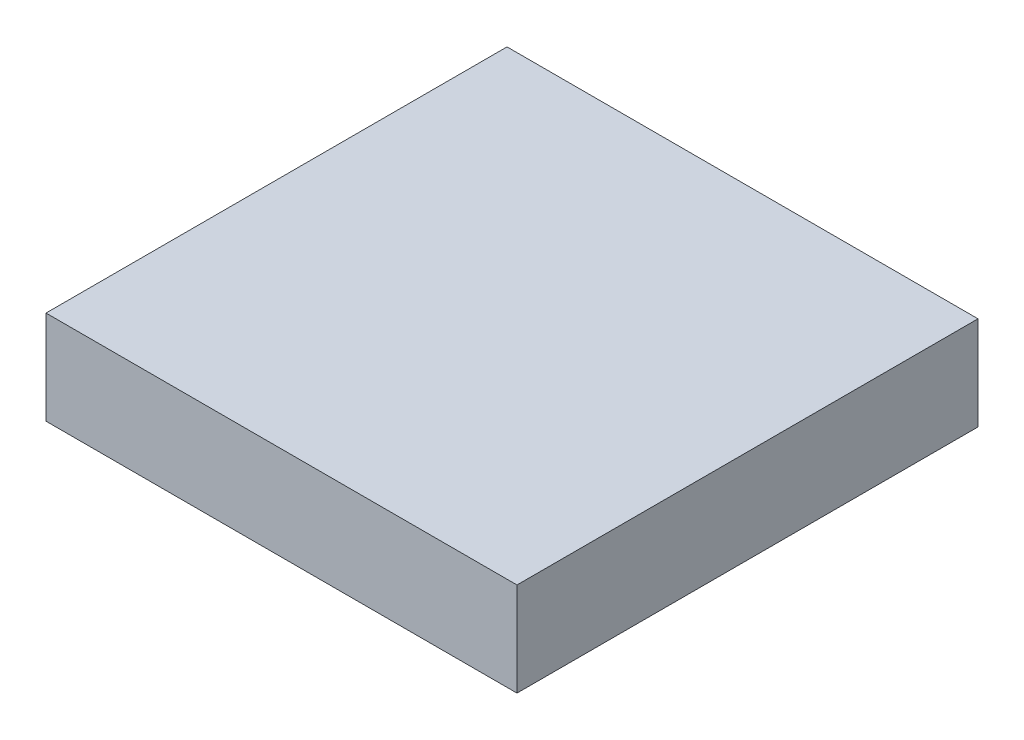
ISO-10303-21;
HEADER;
FILE_DESCRIPTION(('STEP AP214'),'2;1');
FILE_NAME('part.step','',(''),(''),'','','');
FILE_SCHEMA(('AUTOMOTIVE_DESIGN { 1 0 10303 214 1 1 1 1 }'));
ENDSEC;
DATA;
#1=APPLICATION_CONTEXT('core data for automotive mechanical design processes');
#2=APPLICATION_PROTOCOL_DEFINITION('international standard','automotive_design',2000,#1);
#3=PRODUCT_CONTEXT('',#1,'mechanical');
#4=PRODUCT('Part','Part','',(#3));
#5=PRODUCT_RELATED_PRODUCT_CATEGORY('part','',(#4));
#6=PRODUCT_DEFINITION_FORMATION('','',#4);
#7=PRODUCT_DEFINITION_CONTEXT('part definition',#1,'design');
#8=PRODUCT_DEFINITION('design','',#6,#7);
#9=PRODUCT_DEFINITION_SHAPE('','',#8);
#10=(LENGTH_UNIT() NAMED_UNIT(*) SI_UNIT(.MILLI.,.METRE.));
#11=(NAMED_UNIT(*) PLANE_ANGLE_UNIT() SI_UNIT($,.RADIAN.));
#12=(NAMED_UNIT(*) SI_UNIT($,.STERADIAN.) SOLID_ANGLE_UNIT());
#13=UNCERTAINTY_MEASURE_WITH_UNIT(LENGTH_MEASURE(1.E-05),#10,'distance_accuracy_value','');
#14=(GEOMETRIC_REPRESENTATION_CONTEXT(3) GLOBAL_UNCERTAINTY_ASSIGNED_CONTEXT((#13)) GLOBAL_UNIT_ASSIGNED_CONTEXT((#10,
#11,#12)) REPRESENTATION_CONTEXT('',''));
#15=CARTESIAN_POINT('',(0.,0.,0.));
#16=DIRECTION('',(0.,0.,1.));
#17=DIRECTION('',(1.,0.,0.));
#18=AXIS2_PLACEMENT_3D('',#15,#16,#17);
#19=CARTESIAN_POINT('',(-0.46,0.0684,1.));
#20=DIRECTION('',(1.,0.,0.));
#21=DIRECTION('',(0.,0.,-1.));
#22=AXIS2_PLACEMENT_3D('',#19,#20,#21);
#23=PLANE('',#22);
#24=DIRECTION('',(0.,-1.,0.));
#25=VECTOR('',#24,1.);
#26=CARTESIAN_POINT('',(-0.46,0.0684,0.));
#27=LINE('',#26,#25);
#28=CARTESIAN_POINT('',(-0.46,0.2716,0.));
#29=VERTEX_POINT('',#28);
#30=CARTESIAN_POINT('',(-0.46,0.0684,0.));
#31=VERTEX_POINT('',#30);
#32=EDGE_CURVE('E95',#29,#31,#27,.T.);
#33=ORIENTED_EDGE('',*,*,#32,.T.);
#34=DIRECTION('',(0.,0.,-1.));
#35=VECTOR('',#34,1.);
#36=CARTESIAN_POINT('',(-0.46,0.0684,1.));
#37=LINE('',#36,#35);
#38=CARTESIAN_POINT('',(-0.46,0.0684,1.));
#39=VERTEX_POINT('',#38);
#40=EDGE_CURVE('E11',#39,#31,#37,.T.);
#41=ORIENTED_EDGE('',*,*,#40,.F.);
#42=DIRECTION('',(0.,-1.,0.));
#43=VECTOR('',#42,1.);
#44=CARTESIAN_POINT('',(-0.46,0.0684,1.));
#45=LINE('',#44,#43);
#46=CARTESIAN_POINT('',(-0.46,0.2716,1.));
#47=VERTEX_POINT('',#46);
#48=EDGE_CURVE('E83',#47,#39,#45,.T.);
#49=ORIENTED_EDGE('',*,*,#48,.F.);
#50=DIRECTION('',(0.,0.,-1.));
#51=VECTOR('',#50,1.);
#52=CARTESIAN_POINT('',(-0.46,0.2716,1.));
#53=LINE('',#52,#51);
#54=EDGE_CURVE('E91',#47,#29,#53,.T.);
#55=ORIENTED_EDGE('',*,*,#54,.T.);
#56=EDGE_LOOP('',(#33,#41,#49,#55));
#57=FACE_BOUND('',#56,.T.);
#58=ADVANCED_FACE('F32',(#57),#23,.F.);
#59=CARTESIAN_POINT('',(0.5616,0.0684,1.));
#60=DIRECTION('',(0.,1.,0.));
#61=DIRECTION('',(0.,0.,1.));
#62=AXIS2_PLACEMENT_3D('',#59,#60,#61);
#63=PLANE('',#62);
#64=DIRECTION('',(1.,0.,0.));
#65=VECTOR('',#64,1.);
#66=CARTESIAN_POINT('',(0.5616,0.0684,0.));
#67=LINE('',#66,#65);
#68=CARTESIAN_POINT('',(0.5616,0.0684,0.));
#69=VERTEX_POINT('',#68);
#70=EDGE_CURVE('E87',#31,#69,#67,.T.);
#71=ORIENTED_EDGE('',*,*,#70,.T.);
#72=DIRECTION('',(0.,0.,-1.));
#73=VECTOR('',#72,1.);
#74=CARTESIAN_POINT('',(0.5616,0.0684,1.));
#75=LINE('',#74,#73);
#76=CARTESIAN_POINT('',(0.5616,0.0684,1.));
#77=VERTEX_POINT('',#76);
#78=EDGE_CURVE('E40',#77,#69,#75,.T.);
#79=ORIENTED_EDGE('',*,*,#78,.F.);
#80=DIRECTION('',(1.,0.,0.));
#81=VECTOR('',#80,1.);
#82=CARTESIAN_POINT('',(0.5616,0.0684,1.));
#83=LINE('',#82,#81);
#84=EDGE_CURVE('E78',#39,#77,#83,.T.);
#85=ORIENTED_EDGE('',*,*,#84,.F.);
#86=ORIENTED_EDGE('',*,*,#40,.T.);
#87=EDGE_LOOP('',(#71,#79,#85,#86));
#88=FACE_BOUND('',#87,.T.);
#89=ADVANCED_FACE('F86',(#88),#63,.F.);
#90=CARTESIAN_POINT('',(0.5616,0.2716,1.));
#91=DIRECTION('',(-1.,0.,0.));
#92=DIRECTION('',(0.,0.,1.));
#93=AXIS2_PLACEMENT_3D('',#90,#91,#92);
#94=PLANE('',#93);
#95=DIRECTION('',(0.,1.,0.));
#96=VECTOR('',#95,1.);
#97=CARTESIAN_POINT('',(0.5616,0.2716,0.));
#98=LINE('',#97,#96);
#99=CARTESIAN_POINT('',(0.5616,0.2716,0.));
#100=VERTEX_POINT('',#99);
#101=EDGE_CURVE('E65',#69,#100,#98,.T.);
#102=ORIENTED_EDGE('',*,*,#101,.T.);
#103=DIRECTION('',(0.,0.,-1.));
#104=VECTOR('',#103,1.);
#105=CARTESIAN_POINT('',(0.5616,0.2716,1.));
#106=LINE('',#105,#104);
#107=CARTESIAN_POINT('',(0.5616,0.2716,1.));
#108=VERTEX_POINT('',#107);
#109=EDGE_CURVE('E88',#108,#100,#106,.T.);
#110=ORIENTED_EDGE('',*,*,#109,.F.);
#111=DIRECTION('',(0.,1.,0.));
#112=VECTOR('',#111,1.);
#113=CARTESIAN_POINT('',(0.5616,0.2716,1.));
#114=LINE('',#113,#112);
#115=EDGE_CURVE('E81',#77,#108,#114,.T.);
#116=ORIENTED_EDGE('',*,*,#115,.F.);
#117=ORIENTED_EDGE('',*,*,#78,.T.);
#118=EDGE_LOOP('',(#102,#110,#116,#117));
#119=FACE_BOUND('',#118,.T.);
#120=ADVANCED_FACE('F89',(#119),#94,.F.);
#121=CARTESIAN_POINT('',(-0.46,0.2716,1.));
#122=DIRECTION('',(0.,-1.,0.));
#123=DIRECTION('',(0.,0.,-1.));
#124=AXIS2_PLACEMENT_3D('',#121,#122,#123);
#125=PLANE('',#124);
#126=DIRECTION('',(-1.,0.,0.));
#127=VECTOR('',#126,1.);
#128=CARTESIAN_POINT('',(-0.46,0.2716,0.));
#129=LINE('',#128,#127);
#130=EDGE_CURVE('E71',#100,#29,#129,.T.);
#131=ORIENTED_EDGE('',*,*,#130,.T.);
#132=ORIENTED_EDGE('',*,*,#54,.F.);
#133=DIRECTION('',(-1.,0.,0.));
#134=VECTOR('',#133,1.);
#135=CARTESIAN_POINT('',(-0.46,0.2716,1.));
#136=LINE('',#135,#134);
#137=EDGE_CURVE('E48',#108,#47,#136,.T.);
#138=ORIENTED_EDGE('',*,*,#137,.F.);
#139=ORIENTED_EDGE('',*,*,#109,.T.);
#140=EDGE_LOOP('',(#131,#132,#138,#139));
#141=FACE_BOUND('',#140,.T.);
#142=ADVANCED_FACE('F102',(#141),#125,.F.);
#143=CARTESIAN_POINT('',(0.,0.,1.));
#144=DIRECTION('',(0.,0.,-1.));
#145=DIRECTION('',(-1.,0.,0.));
#146=AXIS2_PLACEMENT_3D('',#143,#144,#145);
#147=PLANE('',#146);
#148=ORIENTED_EDGE('',*,*,#48,.T.);
#149=ORIENTED_EDGE('',*,*,#84,.T.);
#150=ORIENTED_EDGE('',*,*,#115,.T.);
#151=ORIENTED_EDGE('',*,*,#137,.T.);
#152=EDGE_LOOP('',(#148,#149,#150,#151));
#153=FACE_BOUND('',#152,.T.);
#154=ADVANCED_FACE('F79',(#153),#147,.F.);
#155=CARTESIAN_POINT('',(0.,0.,0.));
#156=DIRECTION('',(0.,0.,-1.));
#157=DIRECTION('',(-1.,0.,0.));
#158=AXIS2_PLACEMENT_3D('',#155,#156,#157);
#159=PLANE('',#158);
#160=ORIENTED_EDGE('',*,*,#32,.F.);
#161=ORIENTED_EDGE('',*,*,#130,.F.);
#162=ORIENTED_EDGE('',*,*,#101,.F.);
#163=ORIENTED_EDGE('',*,*,#70,.F.);
#164=EDGE_LOOP('',(#160,#161,#162,#163));
#165=FACE_BOUND('',#164,.T.);
#166=ADVANCED_FACE('F105',(#165),#159,.T.);
#167=CLOSED_SHELL('',(#58,#89,#120,#142,#154,#166));
#168=MANIFOLD_SOLID_BREP('B2',#167);
#169=ADVANCED_BREP_SHAPE_REPRESENTATION('',(#18,#168),#14);
#170=SHAPE_DEFINITION_REPRESENTATION(#9,#169);
ENDSEC;
END-ISO-10303-21;
